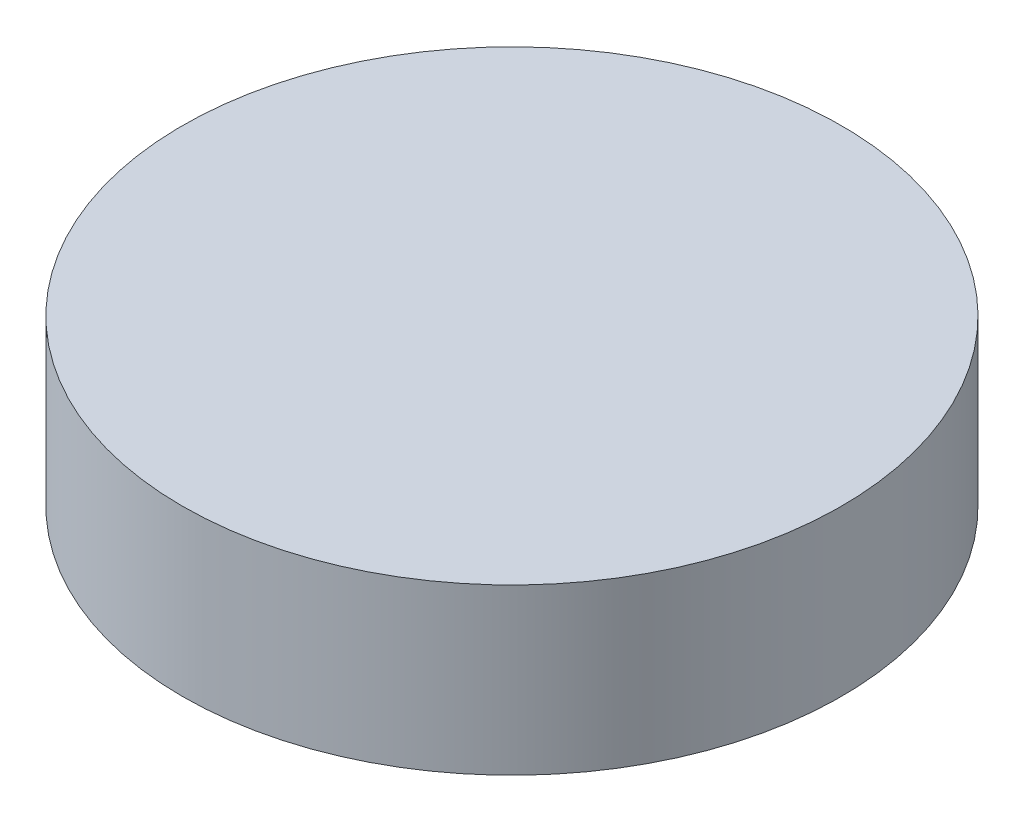
ISO-10303-21;
HEADER;
FILE_DESCRIPTION(('STEP AP214'),'2;1');
FILE_NAME('part.step','',(''),(''),'','','');
FILE_SCHEMA(('AUTOMOTIVE_DESIGN { 1 0 10303 214 1 1 1 1 }'));
ENDSEC;
DATA;
#1=APPLICATION_CONTEXT('core data for automotive mechanical design processes');
#2=APPLICATION_PROTOCOL_DEFINITION('international standard','automotive_design',2000,#1);
#3=PRODUCT_CONTEXT('',#1,'mechanical');
#4=PRODUCT('Part','Part','',(#3));
#5=PRODUCT_RELATED_PRODUCT_CATEGORY('part','',(#4));
#6=PRODUCT_DEFINITION_FORMATION('','',#4);
#7=PRODUCT_DEFINITION_CONTEXT('part definition',#1,'design');
#8=PRODUCT_DEFINITION('design','',#6,#7);
#9=PRODUCT_DEFINITION_SHAPE('','',#8);
#10=(LENGTH_UNIT() NAMED_UNIT(*) SI_UNIT(.MILLI.,.METRE.));
#11=(NAMED_UNIT(*) PLANE_ANGLE_UNIT() SI_UNIT($,.RADIAN.));
#12=(NAMED_UNIT(*) SI_UNIT($,.STERADIAN.) SOLID_ANGLE_UNIT());
#13=UNCERTAINTY_MEASURE_WITH_UNIT(LENGTH_MEASURE(1.E-05),#10,'distance_accuracy_value','');
#14=(GEOMETRIC_REPRESENTATION_CONTEXT(3) GLOBAL_UNCERTAINTY_ASSIGNED_CONTEXT((#13)) GLOBAL_UNIT_ASSIGNED_CONTEXT((#10,
#11,#12)) REPRESENTATION_CONTEXT('',''));
#15=CARTESIAN_POINT('',(0.,0.,0.));
#16=DIRECTION('',(0.,0.,1.));
#17=DIRECTION('',(1.,0.,0.));
#18=AXIS2_PLACEMENT_3D('',#15,#16,#17);
#19=CARTESIAN_POINT('',(0.,2.,0.));
#20=DIRECTION('',(0.,-1.,0.));
#21=DIRECTION('',(0.,0.,-1.));
#22=AXIS2_PLACEMENT_3D('',#19,#20,#21);
#23=CYLINDRICAL_SURFACE('',#22,4.);
#24=CARTESIAN_POINT('',(0.,2.,0.));
#25=DIRECTION('',(0.,1.,0.));
#26=DIRECTION('',(0.,0.,1.));
#27=AXIS2_PLACEMENT_3D('',#24,#25,#26);
#28=CIRCLE('',#27,4.);
#29=CARTESIAN_POINT('',(0.,2.,4.));
#30=VERTEX_POINT('',#29);
#31=EDGE_CURVE('E10',#30,#30,#28,.T.);
#32=ORIENTED_EDGE('',*,*,#31,.F.);
#33=EDGE_LOOP('',(#32));
#34=FACE_BOUND('',#33,.T.);
#35=CARTESIAN_POINT('',(0.,0.,0.));
#36=DIRECTION('',(0.,1.,0.));
#37=DIRECTION('',(0.,0.,1.));
#38=AXIS2_PLACEMENT_3D('',#35,#36,#37);
#39=CIRCLE('',#38,4.);
#40=CARTESIAN_POINT('',(0.,0.,4.));
#41=VERTEX_POINT('',#40);
#42=EDGE_CURVE('E35',#41,#41,#39,.T.);
#43=ORIENTED_EDGE('',*,*,#42,.T.);
#44=EDGE_LOOP('',(#43));
#45=FACE_BOUND('',#44,.T.);
#46=ADVANCED_FACE('F32',(#34,#45),#23,.T.);
#47=CARTESIAN_POINT('',(0.,2.,0.));
#48=DIRECTION('',(0.,1.,0.));
#49=DIRECTION('',(0.,0.,1.));
#50=AXIS2_PLACEMENT_3D('',#47,#48,#49);
#51=PLANE('',#50);
#52=ORIENTED_EDGE('',*,*,#31,.T.);
#53=EDGE_LOOP('',(#52));
#54=FACE_BOUND('',#53,.T.);
#55=ADVANCED_FACE('F47',(#54),#51,.T.);
#56=CARTESIAN_POINT('',(0.,0.,0.));
#57=DIRECTION('',(0.,1.,0.));
#58=DIRECTION('',(0.,0.,1.));
#59=AXIS2_PLACEMENT_3D('',#56,#57,#58);
#60=PLANE('',#59);
#61=ORIENTED_EDGE('',*,*,#42,.F.);
#62=EDGE_LOOP('',(#61));
#63=FACE_BOUND('',#62,.T.);
#64=ADVANCED_FACE('F45',(#63),#60,.F.);
#65=CLOSED_SHELL('',(#46,#55,#64));
#66=MANIFOLD_SOLID_BREP('B2',#65);
#67=ADVANCED_BREP_SHAPE_REPRESENTATION('',(#18,#66),#14);
#68=SHAPE_DEFINITION_REPRESENTATION(#9,#67);
ENDSEC;
END-ISO-10303-21;
